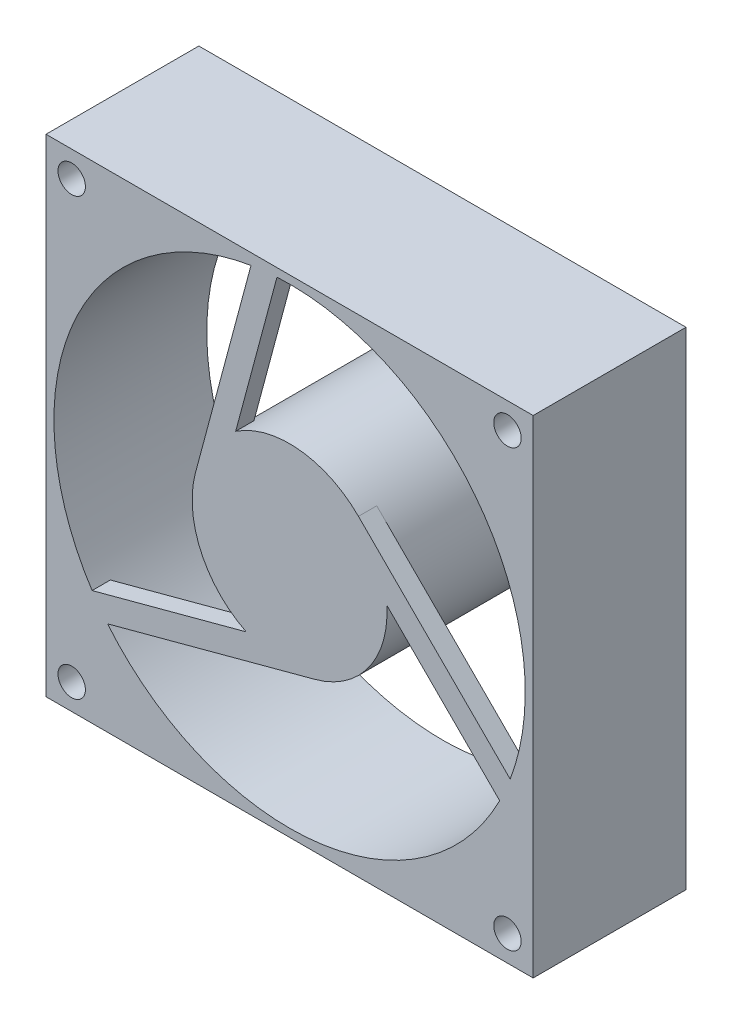
ISO-10303-21;
HEADER;
FILE_DESCRIPTION(('STEP AP214'),'2;1');
FILE_NAME('part.step','',(''),(''),'','','');
FILE_SCHEMA(('AUTOMOTIVE_DESIGN { 1 0 10303 214 1 1 1 1 }'));
ENDSEC;
DATA;
#1=APPLICATION_CONTEXT('core data for automotive mechanical design processes');
#2=APPLICATION_PROTOCOL_DEFINITION('international standard','automotive_design',2000,#1);
#3=PRODUCT_CONTEXT('',#1,'mechanical');
#4=PRODUCT('Part','Part','',(#3));
#5=PRODUCT_RELATED_PRODUCT_CATEGORY('part','',(#4));
#6=PRODUCT_DEFINITION_FORMATION('','',#4);
#7=PRODUCT_DEFINITION_CONTEXT('part definition',#1,'design');
#8=PRODUCT_DEFINITION('design','',#6,#7);
#9=PRODUCT_DEFINITION_SHAPE('','',#8);
#10=(LENGTH_UNIT() NAMED_UNIT(*) SI_UNIT(.MILLI.,.METRE.));
#11=(NAMED_UNIT(*) PLANE_ANGLE_UNIT() SI_UNIT($,.RADIAN.));
#12=(NAMED_UNIT(*) SI_UNIT($,.STERADIAN.) SOLID_ANGLE_UNIT());
#13=UNCERTAINTY_MEASURE_WITH_UNIT(LENGTH_MEASURE(1.E-05),#10,'distance_accuracy_value','');
#14=(GEOMETRIC_REPRESENTATION_CONTEXT(3) GLOBAL_UNCERTAINTY_ASSIGNED_CONTEXT((#13)) GLOBAL_UNIT_ASSIGNED_CONTEXT((#10,
#11,#12)) REPRESENTATION_CONTEXT('',''));
#15=CARTESIAN_POINT('',(0.,0.,0.));
#16=DIRECTION('',(0.,0.,1.));
#17=DIRECTION('',(1.,0.,0.));
#18=AXIS2_PLACEMENT_3D('',#15,#16,#17);
#19=CARTESIAN_POINT('',(0.,-40.,12.55));
#20=DIRECTION('',(0.,1.,0.));
#21=DIRECTION('',(-1.,0.,0.));
#22=AXIS2_PLACEMENT_3D('',#19,#20,#21);
#23=PLANE('',#22);
#24=DIRECTION('',(1.,0.,0.));
#25=VECTOR('',#24,1.);
#26=CARTESIAN_POINT('',(0.,-40.,-12.55));
#27=LINE('',#26,#25);
#28=CARTESIAN_POINT('',(-40.,-40.,-12.55));
#29=VERTEX_POINT('',#28);
#30=CARTESIAN_POINT('',(40.,-40.,-12.55));
#31=VERTEX_POINT('',#30);
#32=EDGE_CURVE('E357',#29,#31,#27,.T.);
#33=ORIENTED_EDGE('',*,*,#32,.T.);
#34=DIRECTION('',(0.,0.,-1.));
#35=VECTOR('',#34,1.);
#36=CARTESIAN_POINT('',(40.,-40.,12.55));
#37=LINE('',#36,#35);
#38=CARTESIAN_POINT('',(40.,-40.,12.55));
#39=VERTEX_POINT('',#38);
#40=EDGE_CURVE('E12',#39,#31,#37,.T.);
#41=ORIENTED_EDGE('',*,*,#40,.F.);
#42=DIRECTION('',(1.,0.,0.));
#43=VECTOR('',#42,1.);
#44=CARTESIAN_POINT('',(0.,-40.,12.55));
#45=LINE('',#44,#43);
#46=CARTESIAN_POINT('',(-40.,-40.,12.55));
#47=VERTEX_POINT('',#46);
#48=EDGE_CURVE('E322',#47,#39,#45,.T.);
#49=ORIENTED_EDGE('',*,*,#48,.F.);
#50=DIRECTION('',(0.,0.,-1.));
#51=VECTOR('',#50,1.);
#52=CARTESIAN_POINT('',(-40.,-40.,12.55));
#53=LINE('',#52,#51);
#54=EDGE_CURVE('E337',#47,#29,#53,.T.);
#55=ORIENTED_EDGE('',*,*,#54,.T.);
#56=EDGE_LOOP('',(#33,#41,#49,#55));
#57=FACE_BOUND('',#56,.T.);
#58=ADVANCED_FACE('F56',(#57),#23,.F.);
#59=CARTESIAN_POINT('',(40.,0.,12.55));
#60=DIRECTION('',(-1.,0.,0.));
#61=DIRECTION('',(0.,0.,1.));
#62=AXIS2_PLACEMENT_3D('',#59,#60,#61);
#63=PLANE('',#62);
#64=DIRECTION('',(0.,1.,0.));
#65=VECTOR('',#64,1.);
#66=CARTESIAN_POINT('',(40.,0.,-12.55));
#67=LINE('',#66,#65);
#68=CARTESIAN_POINT('',(40.,40.,-12.55));
#69=VERTEX_POINT('',#68);
#70=EDGE_CURVE('E361',#31,#69,#67,.T.);
#71=ORIENTED_EDGE('',*,*,#70,.T.);
#72=DIRECTION('',(0.,0.,-1.));
#73=VECTOR('',#72,1.);
#74=CARTESIAN_POINT('',(40.,40.,12.55));
#75=LINE('',#74,#73);
#76=CARTESIAN_POINT('',(40.,40.,12.55));
#77=VERTEX_POINT('',#76);
#78=EDGE_CURVE('E65',#77,#69,#75,.T.);
#79=ORIENTED_EDGE('',*,*,#78,.F.);
#80=DIRECTION('',(0.,1.,0.));
#81=VECTOR('',#80,1.);
#82=CARTESIAN_POINT('',(40.,0.,12.55));
#83=LINE('',#82,#81);
#84=EDGE_CURVE('E326',#39,#77,#83,.T.);
#85=ORIENTED_EDGE('',*,*,#84,.F.);
#86=ORIENTED_EDGE('',*,*,#40,.T.);
#87=EDGE_LOOP('',(#71,#79,#85,#86));
#88=FACE_BOUND('',#87,.T.);
#89=ADVANCED_FACE('F384',(#88),#63,.F.);
#90=CARTESIAN_POINT('',(0.,40.,12.55));
#91=DIRECTION('',(0.,1.,0.));
#92=DIRECTION('',(-1.,0.,0.));
#93=AXIS2_PLACEMENT_3D('',#90,#91,#92);
#94=PLANE('',#93);
#95=DIRECTION('',(1.,0.,0.));
#96=VECTOR('',#95,1.);
#97=CARTESIAN_POINT('',(0.,40.,-12.55));
#98=LINE('',#97,#96);
#99=CARTESIAN_POINT('',(-40.,40.,-12.55));
#100=VERTEX_POINT('',#99);
#101=EDGE_CURVE('E365',#100,#69,#98,.T.);
#102=ORIENTED_EDGE('',*,*,#101,.F.);
#103=DIRECTION('',(0.,0.,-1.));
#104=VECTOR('',#103,1.);
#105=CARTESIAN_POINT('',(-40.,40.,12.55));
#106=LINE('',#105,#104);
#107=CARTESIAN_POINT('',(-40.,40.,12.55));
#108=VERTEX_POINT('',#107);
#109=EDGE_CURVE('E375',#108,#100,#106,.T.);
#110=ORIENTED_EDGE('',*,*,#109,.F.);
#111=DIRECTION('',(1.,0.,0.));
#112=VECTOR('',#111,1.);
#113=CARTESIAN_POINT('',(0.,40.,12.55));
#114=LINE('',#113,#112);
#115=EDGE_CURVE('E329',#108,#77,#114,.T.);
#116=ORIENTED_EDGE('',*,*,#115,.T.);
#117=ORIENTED_EDGE('',*,*,#78,.T.);
#118=EDGE_LOOP('',(#102,#110,#116,#117));
#119=FACE_BOUND('',#118,.T.);
#120=ADVANCED_FACE('F381',(#119),#94,.T.);
#121=CARTESIAN_POINT('',(-35.7796031280393,35.7796031280393,12.55));
#122=DIRECTION('',(0.,0.,-1.));
#123=DIRECTION('',(-1.,0.,0.));
#124=AXIS2_PLACEMENT_3D('',#121,#122,#123);
#125=CYLINDRICAL_SURFACE('',#124,2.25);
#126=CARTESIAN_POINT('',(-35.7796031280393,35.7796031280393,12.55));
#127=DIRECTION('',(0.,0.,1.));
#128=DIRECTION('',(1.,0.,0.));
#129=AXIS2_PLACEMENT_3D('',#126,#127,#128);
#130=CIRCLE('',#129,2.25);
#131=CARTESIAN_POINT('',(-33.5296031280393,35.7796031280393,12.55));
#132=VERTEX_POINT('',#131);
#133=EDGE_CURVE('E318',#132,#132,#130,.T.);
#134=ORIENTED_EDGE('',*,*,#133,.T.);
#135=EDGE_LOOP('',(#134));
#136=FACE_BOUND('',#135,.T.);
#137=CARTESIAN_POINT('',(-35.7796031280393,35.7796031280393,-12.55));
#138=DIRECTION('',(0.,0.,1.));
#139=DIRECTION('',(1.,0.,0.));
#140=AXIS2_PLACEMENT_3D('',#137,#138,#139);
#141=CIRCLE('',#140,2.25);
#142=CARTESIAN_POINT('',(-33.5296031280393,35.7796031280393,-12.55));
#143=VERTEX_POINT('',#142);
#144=EDGE_CURVE('E353',#143,#143,#141,.T.);
#145=ORIENTED_EDGE('',*,*,#144,.F.);
#146=EDGE_LOOP('',(#145));
#147=FACE_BOUND('',#146,.T.);
#148=ADVANCED_FACE('F405',(#136,#147),#125,.F.);
#149=CARTESIAN_POINT('',(35.7796031280393,35.7796031280393,12.55));
#150=DIRECTION('',(0.,0.,-1.));
#151=DIRECTION('',(-1.,0.,0.));
#152=AXIS2_PLACEMENT_3D('',#149,#150,#151);
#153=CYLINDRICAL_SURFACE('',#152,2.25);
#154=CARTESIAN_POINT('',(35.7796031280393,35.7796031280393,12.55));
#155=DIRECTION('',(0.,0.,1.));
#156=DIRECTION('',(1.,0.,0.));
#157=AXIS2_PLACEMENT_3D('',#154,#155,#156);
#158=CIRCLE('',#157,2.25);
#159=CARTESIAN_POINT('',(38.0296031280393,35.7796031280393,12.55));
#160=VERTEX_POINT('',#159);
#161=EDGE_CURVE('E314',#160,#160,#158,.T.);
#162=ORIENTED_EDGE('',*,*,#161,.T.);
#163=EDGE_LOOP('',(#162));
#164=FACE_BOUND('',#163,.T.);
#165=CARTESIAN_POINT('',(35.7796031280393,35.7796031280393,-12.55));
#166=DIRECTION('',(0.,0.,1.));
#167=DIRECTION('',(1.,0.,0.));
#168=AXIS2_PLACEMENT_3D('',#165,#166,#167);
#169=CIRCLE('',#168,2.25);
#170=CARTESIAN_POINT('',(38.0296031280393,35.7796031280393,-12.55));
#171=VERTEX_POINT('',#170);
#172=EDGE_CURVE('E349',#171,#171,#169,.T.);
#173=ORIENTED_EDGE('',*,*,#172,.F.);
#174=EDGE_LOOP('',(#173));
#175=FACE_BOUND('',#174,.T.);
#176=ADVANCED_FACE('F408',(#164,#175),#153,.F.);
#177=CARTESIAN_POINT('',(35.7796031280393,-35.7796031280393,12.55));
#178=DIRECTION('',(0.,0.,-1.));
#179=DIRECTION('',(-1.,0.,0.));
#180=AXIS2_PLACEMENT_3D('',#177,#178,#179);
#181=CYLINDRICAL_SURFACE('',#180,2.25);
#182=CARTESIAN_POINT('',(35.7796031280393,-35.7796031280393,12.55));
#183=DIRECTION('',(0.,0.,1.));
#184=DIRECTION('',(1.,0.,0.));
#185=AXIS2_PLACEMENT_3D('',#182,#183,#184);
#186=CIRCLE('',#185,2.25);
#187=CARTESIAN_POINT('',(38.0296031280393,-35.7796031280393,12.55));
#188=VERTEX_POINT('',#187);
#189=EDGE_CURVE('E310',#188,#188,#186,.T.);
#190=ORIENTED_EDGE('',*,*,#189,.T.);
#191=EDGE_LOOP('',(#190));
#192=FACE_BOUND('',#191,.T.);
#193=CARTESIAN_POINT('',(35.7796031280393,-35.7796031280393,-12.55));
#194=DIRECTION('',(0.,0.,1.));
#195=DIRECTION('',(1.,0.,0.));
#196=AXIS2_PLACEMENT_3D('',#193,#194,#195);
#197=CIRCLE('',#196,2.25);
#198=CARTESIAN_POINT('',(38.0296031280393,-35.7796031280393,-12.55));
#199=VERTEX_POINT('',#198);
#200=EDGE_CURVE('E345',#199,#199,#197,.T.);
#201=ORIENTED_EDGE('',*,*,#200,.F.);
#202=EDGE_LOOP('',(#201));
#203=FACE_BOUND('',#202,.T.);
#204=ADVANCED_FACE('F412',(#192,#203),#181,.F.);
#205=CARTESIAN_POINT('',(-35.7796031280393,-35.7796031280393,12.55));
#206=DIRECTION('',(0.,0.,-1.));
#207=DIRECTION('',(-1.,0.,0.));
#208=AXIS2_PLACEMENT_3D('',#205,#206,#207);
#209=CYLINDRICAL_SURFACE('',#208,2.25);
#210=CARTESIAN_POINT('',(-35.7796031280393,-35.7796031280393,12.55));
#211=DIRECTION('',(0.,0.,1.));
#212=DIRECTION('',(1.,0.,0.));
#213=AXIS2_PLACEMENT_3D('',#210,#211,#212);
#214=CIRCLE('',#213,2.25);
#215=CARTESIAN_POINT('',(-33.5296031280393,-35.7796031280393,12.55));
#216=VERTEX_POINT('',#215);
#217=EDGE_CURVE('E304',#216,#216,#214,.T.);
#218=ORIENTED_EDGE('',*,*,#217,.T.);
#219=EDGE_LOOP('',(#218));
#220=FACE_BOUND('',#219,.T.);
#221=CARTESIAN_POINT('',(-35.7796031280393,-35.7796031280393,-12.55));
#222=DIRECTION('',(0.,0.,1.));
#223=DIRECTION('',(1.,0.,0.));
#224=AXIS2_PLACEMENT_3D('',#221,#222,#223);
#225=CIRCLE('',#224,2.25);
#226=CARTESIAN_POINT('',(-33.5296031280393,-35.7796031280393,-12.55));
#227=VERTEX_POINT('',#226);
#228=EDGE_CURVE('E341',#227,#227,#225,.T.);
#229=ORIENTED_EDGE('',*,*,#228,.F.);
#230=EDGE_LOOP('',(#229));
#231=FACE_BOUND('',#230,.T.);
#232=ADVANCED_FACE('F415',(#220,#231),#209,.F.);
#233=CARTESIAN_POINT('',(0.,0.,12.55));
#234=DIRECTION('',(0.,0.,-1.));
#235=DIRECTION('',(-1.,0.,0.));
#236=AXIS2_PLACEMENT_3D('',#233,#234,#235);
#237=CYLINDRICAL_SURFACE('',#236,38.7);
#238=DIRECTION('',(0.,0.,1.));
#239=VECTOR('',#238,1.);
#240=CARTESIAN_POINT('',(36.2304699257833,-13.6030529278135,9.55));
#241=LINE('',#240,#239);
#242=CARTESIAN_POINT('',(36.2304699257834,-13.6030529278137,9.55));
#243=VERTEX_POINT('',#242);
#244=CARTESIAN_POINT('',(36.2304699257833,-13.6030529278135,12.55));
#245=VERTEX_POINT('',#244);
#246=EDGE_CURVE('E210',#243,#245,#241,.T.);
#247=ORIENTED_EDGE('',*,*,#246,.T.);
#248=CARTESIAN_POINT('',(0.,0.,12.55));
#249=DIRECTION('',(0.,0.,1.));
#250=DIRECTION('',(1.,0.,0.));
#251=AXIS2_PLACEMENT_3D('',#248,#249,#250);
#252=CIRCLE('',#251,38.7);
#253=CARTESIAN_POINT('',(-2.06850336182368,38.6446800199216,12.55));
#254=VERTEX_POINT('',#253);
#255=EDGE_CURVE('E306',#245,#254,#252,.T.);
#256=ORIENTED_EDGE('',*,*,#255,.T.);
#257=DIRECTION('',(0.,0.,1.));
#258=VECTOR('',#257,1.);
#259=CARTESIAN_POINT('',(-2.06850336182374,38.6446800199213,9.55));
#260=LINE('',#259,#258);
#261=CARTESIAN_POINT('',(-2.06850336182375,38.6446800199216,9.55));
#262=VERTEX_POINT('',#261);
#263=EDGE_CURVE('E294',#262,#254,#260,.T.);
#264=ORIENTED_EDGE('',*,*,#263,.F.);
#265=CARTESIAN_POINT('',(0.,0.,9.55));
#266=DIRECTION('',(0.,0.,1.));
#267=DIRECTION('',(-1.,0.,0.));
#268=AXIS2_PLACEMENT_3D('',#265,#266,#267);
#269=CIRCLE('',#268,38.6999999999998);
#270=CARTESIAN_POINT('',(-6.3346455583804,38.1780338106835,9.55));
#271=VERTEX_POINT('',#270);
#272=EDGE_CURVE('E272',#262,#271,#269,.T.);
#273=ORIENTED_EDGE('',*,*,#272,.T.);
#274=DIRECTION('',(0.,0.,1.));
#275=VECTOR('',#274,1.);
#276=CARTESIAN_POINT('',(-6.33464555838046,38.1780338106832,9.55));
#277=LINE('',#276,#275);
#278=CARTESIAN_POINT('',(-6.33464555838046,38.1780338106832,12.55));
#279=VERTEX_POINT('',#278);
#280=EDGE_CURVE('E290',#271,#279,#277,.T.);
#281=ORIENTED_EDGE('',*,*,#280,.T.);
#282=CARTESIAN_POINT('',(-32.4330229374611,-21.1137164691138,12.55));
#283=VERTEX_POINT('',#282);
#284=EDGE_CURVE('E301',#279,#283,#252,.T.);
#285=ORIENTED_EDGE('',*,*,#284,.T.);
#286=DIRECTION('',(0.,0.,1.));
#287=VECTOR('',#286,1.);
#288=CARTESIAN_POINT('',(-32.4330229374608,-21.1137164691137,9.55));
#289=LINE('',#288,#287);
#290=CARTESIAN_POINT('',(-32.433022937461,-21.1137164691138,9.55));
#291=VERTEX_POINT('',#290);
#292=EDGE_CURVE('E246',#291,#283,#289,.T.);
#293=ORIENTED_EDGE('',*,*,#292,.F.);
#294=CARTESIAN_POINT('',(0.,0.,9.55));
#295=DIRECTION('',(0.,0.,1.));
#296=DIRECTION('',(0.500000000000004,-0.866025403784436,0.));
#297=AXIS2_PLACEMENT_3D('',#294,#295,#296);
#298=CIRCLE('',#297,38.6999999999998);
#299=CARTESIAN_POINT('',(-29.8958243674028,-24.5749808828696,9.55));
#300=VERTEX_POINT('',#299);
#301=EDGE_CURVE('E224',#291,#300,#298,.T.);
#302=ORIENTED_EDGE('',*,*,#301,.T.);
#303=DIRECTION('',(0.,0.,1.));
#304=VECTOR('',#303,1.);
#305=CARTESIAN_POINT('',(-29.8958243674026,-24.5749808828695,9.55));
#306=LINE('',#305,#304);
#307=CARTESIAN_POINT('',(-29.8958243674026,-24.5749808828695,12.55));
#308=VERTEX_POINT('',#307);
#309=EDGE_CURVE('E242',#300,#308,#306,.T.);
#310=ORIENTED_EDGE('',*,*,#309,.T.);
#311=CARTESIAN_POINT('',(34.501526299285,-17.5309635508076,12.55));
#312=VERTEX_POINT('',#311);
#313=EDGE_CURVE('E305',#308,#312,#252,.T.);
#314=ORIENTED_EDGE('',*,*,#313,.T.);
#315=DIRECTION('',(0.,0.,1.));
#316=VECTOR('',#315,1.);
#317=CARTESIAN_POINT('',(34.5015262992848,-17.5309635508075,9.55));
#318=LINE('',#317,#316);
#319=CARTESIAN_POINT('',(34.501526299285,-17.5309635508076,9.55));
#320=VERTEX_POINT('',#319);
#321=EDGE_CURVE('E72',#320,#312,#318,.T.);
#322=ORIENTED_EDGE('',*,*,#321,.F.);
#323=CARTESIAN_POINT('',(0.,0.,9.55));
#324=DIRECTION('',(0.,0.,1.));
#325=DIRECTION('',(0.499999999999992,0.866025403784443,0.));
#326=AXIS2_PLACEMENT_3D('',#323,#324,#325);
#327=CIRCLE('',#326,38.6999999999998);
#328=EDGE_CURVE('E76',#320,#243,#327,.T.);
#329=ORIENTED_EDGE('',*,*,#328,.T.);
#330=EDGE_LOOP('',(#247,#256,#264,#273,#281,#285,#293,#302,#310,#314,#322,#329));
#331=FACE_BOUND('',#330,.T.);
#332=CARTESIAN_POINT('',(0.,0.,-12.55));
#333=DIRECTION('',(0.,0.,1.));
#334=DIRECTION('',(1.,0.,0.));
#335=AXIS2_PLACEMENT_3D('',#332,#333,#334);
#336=CIRCLE('',#335,38.7);
#337=CARTESIAN_POINT('',(38.7,0.,-12.55));
#338=VERTEX_POINT('',#337);
#339=EDGE_CURVE('E289',#338,#338,#336,.T.);
#340=ORIENTED_EDGE('',*,*,#339,.F.);
#341=EDGE_LOOP('',(#340));
#342=FACE_BOUND('',#341,.T.);
#343=ADVANCED_FACE('F58',(#331,#342),#237,.F.);
#344=CARTESIAN_POINT('',(-40.,0.,12.55));
#345=DIRECTION('',(-1.,0.,0.));
#346=DIRECTION('',(0.,0.,1.));
#347=AXIS2_PLACEMENT_3D('',#344,#345,#346);
#348=PLANE('',#347);
#349=DIRECTION('',(0.,1.,0.));
#350=VECTOR('',#349,1.);
#351=CARTESIAN_POINT('',(-40.,0.,-12.55));
#352=LINE('',#351,#350);
#353=EDGE_CURVE('E369',#29,#100,#352,.T.);
#354=ORIENTED_EDGE('',*,*,#353,.F.);
#355=ORIENTED_EDGE('',*,*,#54,.F.);
#356=DIRECTION('',(0.,1.,0.));
#357=VECTOR('',#356,1.);
#358=CARTESIAN_POINT('',(-40.,0.,12.55));
#359=LINE('',#358,#357);
#360=EDGE_CURVE('E333',#47,#108,#359,.T.);
#361=ORIENTED_EDGE('',*,*,#360,.T.);
#362=ORIENTED_EDGE('',*,*,#109,.T.);
#363=EDGE_LOOP('',(#354,#355,#361,#362));
#364=FACE_BOUND('',#363,.T.);
#365=ADVANCED_FACE('F391',(#364),#348,.T.);
#366=CARTESIAN_POINT('',(0.,0.,12.55));
#367=DIRECTION('',(0.,0.,1.));
#368=DIRECTION('',(1.,0.,0.));
#369=AXIS2_PLACEMENT_3D('',#366,#367,#368);
#370=PLANE('',#369);
#371=ORIENTED_EDGE('',*,*,#255,.F.);
#372=DIRECTION('',(-0.707106781186553,0.707106781186541,0.));
#373=VECTOR('',#372,1.);
#374=CARTESIAN_POINT('',(11.3137084989844,11.3137084989849,12.55));
#375=LINE('',#374,#373);
#376=CARTESIAN_POINT('',(11.3137084989845,11.313708498985,12.55));
#377=VERTEX_POINT('',#376);
#378=EDGE_CURVE('E196',#245,#377,#375,.T.);
#379=ORIENTED_EDGE('',*,*,#378,.T.);
#380=CARTESIAN_POINT('',(0.,0.,12.55));
#381=DIRECTION('',(0.,0.,1.));
#382=DIRECTION('',(1.,0.,0.));
#383=AXIS2_PLACEMENT_3D('',#380,#381,#382);
#384=CIRCLE('',#383,16.);
#385=CARTESIAN_POINT('',(-8.85202660383478,13.3282266264118,12.55));
#386=VERTEX_POINT('',#385);
#387=EDGE_CURVE('E259',#377,#386,#384,.T.);
#388=ORIENTED_EDGE('',*,*,#387,.T.);
#389=DIRECTION('',(0.258819045102521,0.965925826289068,0.));
#390=VECTOR('',#389,1.);
#391=CARTESIAN_POINT('',(-8.85202660383478,13.3282266264118,12.55));
#392=LINE('',#391,#390);
#393=EDGE_CURVE('E257',#386,#254,#392,.T.);
#394=ORIENTED_EDGE('',*,*,#393,.T.);
#395=EDGE_LOOP('',(#371,#379,#388,#394));
#396=FACE_BOUND('',#395,.T.);
#397=ORIENTED_EDGE('',*,*,#313,.F.);
#398=DIRECTION('',(0.965925826289067,0.258819045102525,0.));
#399=VECTOR('',#398,1.);
#400=CARTESIAN_POINT('',(4.14110472164052,-15.4548132206249,12.55));
#401=LINE('',#400,#399);
#402=CARTESIAN_POINT('',(4.14110472164056,-15.454813220625,12.55));
#403=VERTEX_POINT('',#402);
#404=EDGE_CURVE('E220',#308,#403,#401,.T.);
#405=ORIENTED_EDGE('',*,*,#404,.T.);
#406=CARTESIAN_POINT('',(15.9685961477862,1.00196660069083,12.55));
#407=VERTEX_POINT('',#406);
#408=EDGE_CURVE('E258',#403,#407,#384,.T.);
#409=ORIENTED_EDGE('',*,*,#408,.T.);
#410=DIRECTION('',(0.707106781186553,-0.707106781186541,0.));
#411=VECTOR('',#410,1.);
#412=CARTESIAN_POINT('',(15.9685961477862,1.00196660069083,12.55));
#413=LINE('',#412,#411);
#414=EDGE_CURVE('E174',#407,#312,#413,.T.);
#415=ORIENTED_EDGE('',*,*,#414,.T.);
#416=EDGE_LOOP('',(#397,#405,#409,#415));
#417=FACE_BOUND('',#416,.T.);
#418=ORIENTED_EDGE('',*,*,#284,.F.);
#419=DIRECTION('',(-0.258819045102521,-0.965925826289068,0.));
#420=VECTOR('',#419,1.);
#421=CARTESIAN_POINT('',(-15.454813220625,4.14110472164014,12.55));
#422=LINE('',#421,#420);
#423=CARTESIAN_POINT('',(-15.454813220625,4.14110472164014,12.55));
#424=VERTEX_POINT('',#423);
#425=EDGE_CURVE('E268',#279,#424,#422,.T.);
#426=ORIENTED_EDGE('',*,*,#425,.T.);
#427=CARTESIAN_POINT('',(-7.11656954395137,-14.3301932271026,12.55));
#428=VERTEX_POINT('',#427);
#429=EDGE_CURVE('E253',#424,#428,#384,.T.);
#430=ORIENTED_EDGE('',*,*,#429,.T.);
#431=DIRECTION('',(-0.965925826289067,-0.258819045102525,0.));
#432=VECTOR('',#431,1.);
#433=CARTESIAN_POINT('',(-7.11656954395137,-14.3301932271026,12.55));
#434=LINE('',#433,#432);
#435=EDGE_CURVE('E209',#428,#283,#434,.T.);
#436=ORIENTED_EDGE('',*,*,#435,.T.);
#437=EDGE_LOOP('',(#418,#426,#430,#436));
#438=FACE_BOUND('',#437,.T.);
#439=ORIENTED_EDGE('',*,*,#217,.F.);
#440=EDGE_LOOP('',(#439));
#441=FACE_BOUND('',#440,.T.);
#442=ORIENTED_EDGE('',*,*,#189,.F.);
#443=EDGE_LOOP('',(#442));
#444=FACE_BOUND('',#443,.T.);
#445=ORIENTED_EDGE('',*,*,#161,.F.);
#446=EDGE_LOOP('',(#445));
#447=FACE_BOUND('',#446,.T.);
#448=ORIENTED_EDGE('',*,*,#133,.F.);
#449=EDGE_LOOP('',(#448));
#450=FACE_BOUND('',#449,.T.);
#451=ORIENTED_EDGE('',*,*,#48,.T.);
#452=ORIENTED_EDGE('',*,*,#84,.T.);
#453=ORIENTED_EDGE('',*,*,#115,.F.);
#454=ORIENTED_EDGE('',*,*,#360,.F.);
#455=EDGE_LOOP('',(#451,#452,#453,#454));
#456=FACE_BOUND('',#455,.T.);
#457=ADVANCED_FACE('F395',(#396,#417,#438,#441,#444,#447,#450,#456),#370,.T.);
#458=CARTESIAN_POINT('',(0.,0.,-12.55));
#459=DIRECTION('',(0.,0.,1.));
#460=DIRECTION('',(1.,0.,0.));
#461=AXIS2_PLACEMENT_3D('',#458,#459,#460);
#462=PLANE('',#461);
#463=ORIENTED_EDGE('',*,*,#339,.T.);
#464=EDGE_LOOP('',(#463));
#465=FACE_BOUND('',#464,.T.);
#466=ORIENTED_EDGE('',*,*,#228,.T.);
#467=EDGE_LOOP('',(#466));
#468=FACE_BOUND('',#467,.T.);
#469=ORIENTED_EDGE('',*,*,#200,.T.);
#470=EDGE_LOOP('',(#469));
#471=FACE_BOUND('',#470,.T.);
#472=ORIENTED_EDGE('',*,*,#172,.T.);
#473=EDGE_LOOP('',(#472));
#474=FACE_BOUND('',#473,.T.);
#475=ORIENTED_EDGE('',*,*,#144,.T.);
#476=EDGE_LOOP('',(#475));
#477=FACE_BOUND('',#476,.T.);
#478=ORIENTED_EDGE('',*,*,#32,.F.);
#479=ORIENTED_EDGE('',*,*,#353,.T.);
#480=ORIENTED_EDGE('',*,*,#101,.T.);
#481=ORIENTED_EDGE('',*,*,#70,.F.);
#482=EDGE_LOOP('',(#478,#479,#480,#481));
#483=FACE_BOUND('',#482,.T.);
#484=ADVANCED_FACE('F388',(#465,#468,#471,#474,#477,#483),#462,.F.);
#485=CARTESIAN_POINT('',(-15.454813220625,4.14110472164014,9.55));
#486=DIRECTION('',(-0.965925826289068,0.258819045102521,0.));
#487=DIRECTION('',(-0.258819045102521,-0.965925826289068,0.));
#488=AXIS2_PLACEMENT_3D('',#485,#486,#487);
#489=PLANE('',#488);
#490=ORIENTED_EDGE('',*,*,#425,.F.);
#491=ORIENTED_EDGE('',*,*,#280,.F.);
#492=DIRECTION('',(-0.258819045102521,-0.965925826289068,0.));
#493=VECTOR('',#492,1.);
#494=CARTESIAN_POINT('',(-15.454813220625,4.14110472164014,9.55));
#495=LINE('',#494,#493);
#496=CARTESIAN_POINT('',(-15.454813220625,4.14110472164014,9.55));
#497=VERTEX_POINT('',#496);
#498=EDGE_CURVE('E275',#271,#497,#495,.T.);
#499=ORIENTED_EDGE('',*,*,#498,.T.);
#500=DIRECTION('',(0.,0.,1.));
#501=VECTOR('',#500,1.);
#502=CARTESIAN_POINT('',(-15.454813220625,4.14110472164014,9.55));
#503=LINE('',#502,#501);
#504=EDGE_CURVE('E286',#497,#424,#503,.T.);
#505=ORIENTED_EDGE('',*,*,#504,.T.);
#506=EDGE_LOOP('',(#490,#491,#499,#505));
#507=FACE_BOUND('',#506,.T.);
#508=ADVANCED_FACE('F428',(#507),#489,.T.);
#509=CARTESIAN_POINT('',(-8.85202660383478,13.3282266264118,9.55));
#510=DIRECTION('',(0.965925826289068,-0.258819045102521,0.));
#511=DIRECTION('',(0.258819045102521,0.965925826289068,0.));
#512=AXIS2_PLACEMENT_3D('',#509,#510,#511);
#513=PLANE('',#512);
#514=ORIENTED_EDGE('',*,*,#393,.F.);
#515=DIRECTION('',(0.,0.,1.));
#516=VECTOR('',#515,1.);
#517=CARTESIAN_POINT('',(-8.85202660383478,13.3282266264118,9.55));
#518=LINE('',#517,#516);
#519=CARTESIAN_POINT('',(-8.85202660383491,13.328226626412,9.55));
#520=VERTEX_POINT('',#519);
#521=EDGE_CURVE('E279',#520,#386,#518,.T.);
#522=ORIENTED_EDGE('',*,*,#521,.F.);
#523=DIRECTION('',(0.258819045102521,0.965925826289068,0.));
#524=VECTOR('',#523,1.);
#525=CARTESIAN_POINT('',(-8.85202660383478,13.3282266264118,9.55));
#526=LINE('',#525,#524);
#527=EDGE_CURVE('E267',#520,#262,#526,.T.);
#528=ORIENTED_EDGE('',*,*,#527,.T.);
#529=ORIENTED_EDGE('',*,*,#263,.T.);
#530=EDGE_LOOP('',(#514,#522,#528,#529));
#531=FACE_BOUND('',#530,.T.);
#532=ADVANCED_FACE('F443',(#531),#513,.T.);
#533=CARTESIAN_POINT('',(0.,0.,9.55));
#534=DIRECTION('',(0.,0.,-1.));
#535=DIRECTION('',(-1.,0.,0.));
#536=AXIS2_PLACEMENT_3D('',#533,#534,#535);
#537=PLANE('',#536);
#538=CARTESIAN_POINT('',(0.,0.,9.55));
#539=DIRECTION('',(0.,0.,-1.));
#540=DIRECTION('',(-1.,0.,0.));
#541=AXIS2_PLACEMENT_3D('',#538,#539,#540);
#542=CIRCLE('',#541,15.9999999999998);
#543=EDGE_CURVE('E263',#497,#520,#542,.T.);
#544=ORIENTED_EDGE('',*,*,#543,.F.);
#545=ORIENTED_EDGE('',*,*,#498,.F.);
#546=ORIENTED_EDGE('',*,*,#272,.F.);
#547=ORIENTED_EDGE('',*,*,#527,.F.);
#548=EDGE_LOOP('',(#544,#545,#546,#547));
#549=FACE_BOUND('',#548,.T.);
#550=ADVANCED_FACE('F501',(#549),#537,.T.);
#551=CARTESIAN_POINT('',(0.,0.,12.55));
#552=DIRECTION('',(0.,0.,-1.));
#553=DIRECTION('',(-1.,0.,0.));
#554=AXIS2_PLACEMENT_3D('',#551,#552,#553);
#555=CYLINDRICAL_SURFACE('',#554,16.);
#556=ORIENTED_EDGE('',*,*,#387,.F.);
#557=DIRECTION('',(0.,0.,1.));
#558=VECTOR('',#557,1.);
#559=CARTESIAN_POINT('',(11.3137084989844,11.3137084989849,9.55));
#560=LINE('',#559,#558);
#561=CARTESIAN_POINT('',(11.3137084989844,11.3137084989849,9.55));
#562=VERTEX_POINT('',#561);
#563=EDGE_CURVE('E194',#562,#377,#560,.T.);
#564=ORIENTED_EDGE('',*,*,#563,.F.);
#565=CARTESIAN_POINT('',(0.,0.,9.55));
#566=DIRECTION('',(0.,0.,-1.));
#567=DIRECTION('',(0.499999999999992,0.866025403784443,0.));
#568=AXIS2_PLACEMENT_3D('',#565,#566,#567);
#569=CIRCLE('',#568,15.9999999999998);
#570=CARTESIAN_POINT('',(15.9685961477862,1.00196660069083,9.55));
#571=VERTEX_POINT('',#570);
#572=EDGE_CURVE('E185',#562,#571,#569,.T.);
#573=ORIENTED_EDGE('',*,*,#572,.T.);
#574=DIRECTION('',(0.,0.,1.));
#575=VECTOR('',#574,1.);
#576=CARTESIAN_POINT('',(15.9685961477862,1.00196660069083,9.55));
#577=LINE('',#576,#575);
#578=EDGE_CURVE('E169',#571,#407,#577,.T.);
#579=ORIENTED_EDGE('',*,*,#578,.T.);
#580=ORIENTED_EDGE('',*,*,#408,.F.);
#581=DIRECTION('',(0.,0.,1.));
#582=VECTOR('',#581,1.);
#583=CARTESIAN_POINT('',(4.14110472164052,-15.4548132206249,9.55));
#584=LINE('',#583,#582);
#585=CARTESIAN_POINT('',(4.14110472164052,-15.4548132206249,9.55));
#586=VERTEX_POINT('',#585);
#587=EDGE_CURVE('E237',#586,#403,#584,.T.);
#588=ORIENTED_EDGE('',*,*,#587,.F.);
#589=CARTESIAN_POINT('',(0.,0.,9.55));
#590=DIRECTION('',(0.,0.,-1.));
#591=DIRECTION('',(0.500000000000004,-0.866025403784436,0.));
#592=AXIS2_PLACEMENT_3D('',#589,#590,#591);
#593=CIRCLE('',#592,15.9999999999998);
#594=CARTESIAN_POINT('',(-7.11656954395137,-14.3301932271026,9.55));
#595=VERTEX_POINT('',#594);
#596=EDGE_CURVE('E215',#586,#595,#593,.T.);
#597=ORIENTED_EDGE('',*,*,#596,.T.);
#598=DIRECTION('',(0.,0.,1.));
#599=VECTOR('',#598,1.);
#600=CARTESIAN_POINT('',(-7.11656954395137,-14.3301932271026,9.55));
#601=LINE('',#600,#599);
#602=EDGE_CURVE('E231',#595,#428,#601,.T.);
#603=ORIENTED_EDGE('',*,*,#602,.T.);
#604=ORIENTED_EDGE('',*,*,#429,.F.);
#605=ORIENTED_EDGE('',*,*,#504,.F.);
#606=ORIENTED_EDGE('',*,*,#543,.T.);
#607=ORIENTED_EDGE('',*,*,#521,.T.);
#608=EDGE_LOOP('',(#556,#564,#573,#579,#580,#588,#597,#603,#604,#605,#606,#607));
#609=FACE_BOUND('',#608,.T.);
#610=CARTESIAN_POINT('',(0.,0.,-12.55));
#611=DIRECTION('',(0.,0.,1.));
#612=DIRECTION('',(1.,0.,0.));
#613=AXIS2_PLACEMENT_3D('',#610,#611,#612);
#614=CIRCLE('',#613,16.);
#615=CARTESIAN_POINT('',(16.,0.,-12.55));
#616=VERTEX_POINT('',#615);
#617=EDGE_CURVE('E241',#616,#616,#614,.T.);
#618=ORIENTED_EDGE('',*,*,#617,.T.);
#619=EDGE_LOOP('',(#618));
#620=FACE_BOUND('',#619,.T.);
#621=ADVANCED_FACE('F191',(#609,#620),#555,.T.);
#622=CARTESIAN_POINT('',(0.,0.,-12.55));
#623=DIRECTION('',(0.,0.,1.));
#624=DIRECTION('',(1.,0.,0.));
#625=AXIS2_PLACEMENT_3D('',#622,#623,#624);
#626=PLANE('',#625);
#627=ORIENTED_EDGE('',*,*,#617,.F.);
#628=EDGE_LOOP('',(#627));
#629=FACE_BOUND('',#628,.T.);
#630=ADVANCED_FACE('F517',(#629),#626,.F.);
#631=CARTESIAN_POINT('',(4.14110472164052,-15.4548132206249,9.55));
#632=DIRECTION('',(0.258819045102525,-0.965925826289067,0.));
#633=DIRECTION('',(0.965925826289067,0.258819045102525,0.));
#634=AXIS2_PLACEMENT_3D('',#631,#632,#633);
#635=PLANE('',#634);
#636=ORIENTED_EDGE('',*,*,#404,.F.);
#637=ORIENTED_EDGE('',*,*,#309,.F.);
#638=DIRECTION('',(0.965925826289067,0.258819045102525,0.));
#639=VECTOR('',#638,1.);
#640=CARTESIAN_POINT('',(4.14110472164052,-15.4548132206249,9.55));
#641=LINE('',#640,#639);
#642=EDGE_CURVE('E227',#300,#586,#641,.T.);
#643=ORIENTED_EDGE('',*,*,#642,.T.);
#644=ORIENTED_EDGE('',*,*,#587,.T.);
#645=EDGE_LOOP('',(#636,#637,#643,#644));
#646=FACE_BOUND('',#645,.T.);
#647=ADVANCED_FACE('F522',(#646),#635,.T.);
#648=CARTESIAN_POINT('',(-7.11656954395137,-14.3301932271026,9.55));
#649=DIRECTION('',(-0.258819045102525,0.965925826289067,0.));
#650=DIRECTION('',(-0.965925826289067,-0.258819045102525,0.));
#651=AXIS2_PLACEMENT_3D('',#648,#649,#650);
#652=PLANE('',#651);
#653=ORIENTED_EDGE('',*,*,#435,.F.);
#654=ORIENTED_EDGE('',*,*,#602,.F.);
#655=DIRECTION('',(-0.965925826289067,-0.258819045102525,0.));
#656=VECTOR('',#655,1.);
#657=CARTESIAN_POINT('',(-7.11656954395137,-14.3301932271026,9.55));
#658=LINE('',#657,#656);
#659=EDGE_CURVE('E219',#595,#291,#658,.T.);
#660=ORIENTED_EDGE('',*,*,#659,.T.);
#661=ORIENTED_EDGE('',*,*,#292,.T.);
#662=EDGE_LOOP('',(#653,#654,#660,#661));
#663=FACE_BOUND('',#662,.T.);
#664=ADVANCED_FACE('F550',(#663),#652,.T.);
#665=CARTESIAN_POINT('',(0.,0.,9.55));
#666=DIRECTION('',(0.,0.,-1.));
#667=DIRECTION('',(0.500000000000004,-0.866025403784436,0.));
#668=AXIS2_PLACEMENT_3D('',#665,#666,#667);
#669=PLANE('',#668);
#670=ORIENTED_EDGE('',*,*,#596,.F.);
#671=ORIENTED_EDGE('',*,*,#642,.F.);
#672=ORIENTED_EDGE('',*,*,#301,.F.);
#673=ORIENTED_EDGE('',*,*,#659,.F.);
#674=EDGE_LOOP('',(#670,#671,#672,#673));
#675=FACE_BOUND('',#674,.T.);
#676=ADVANCED_FACE('F560',(#675),#669,.T.);
#677=CARTESIAN_POINT('',(11.3137084989844,11.3137084989849,9.55));
#678=DIRECTION('',(0.707106781186542,0.707106781186553,0.));
#679=DIRECTION('',(-0.707106781186553,0.707106781186542,0.));
#680=AXIS2_PLACEMENT_3D('',#677,#678,#679);
#681=PLANE('',#680);
#682=ORIENTED_EDGE('',*,*,#378,.F.);
#683=ORIENTED_EDGE('',*,*,#246,.F.);
#684=DIRECTION('',(-0.707106781186553,0.707106781186541,0.));
#685=VECTOR('',#684,1.);
#686=CARTESIAN_POINT('',(11.3137084989844,11.3137084989849,9.55));
#687=LINE('',#686,#685);
#688=EDGE_CURVE('E180',#243,#562,#687,.T.);
#689=ORIENTED_EDGE('',*,*,#688,.T.);
#690=ORIENTED_EDGE('',*,*,#563,.T.);
#691=EDGE_LOOP('',(#682,#683,#689,#690));
#692=FACE_BOUND('',#691,.T.);
#693=ADVANCED_FACE('F570',(#692),#681,.T.);
#694=CARTESIAN_POINT('',(15.9685961477862,1.00196660069083,9.55));
#695=DIRECTION('',(-0.707106781186542,-0.707106781186553,0.));
#696=DIRECTION('',(0.707106781186553,-0.707106781186542,0.));
#697=AXIS2_PLACEMENT_3D('',#694,#695,#696);
#698=PLANE('',#697);
#699=ORIENTED_EDGE('',*,*,#414,.F.);
#700=ORIENTED_EDGE('',*,*,#578,.F.);
#701=DIRECTION('',(0.707106781186553,-0.707106781186541,0.));
#702=VECTOR('',#701,1.);
#703=CARTESIAN_POINT('',(15.9685961477862,1.00196660069083,9.55));
#704=LINE('',#703,#702);
#705=EDGE_CURVE('E172',#571,#320,#704,.T.);
#706=ORIENTED_EDGE('',*,*,#705,.T.);
#707=ORIENTED_EDGE('',*,*,#321,.T.);
#708=EDGE_LOOP('',(#699,#700,#706,#707));
#709=FACE_BOUND('',#708,.T.);
#710=ADVANCED_FACE('F171',(#709),#698,.T.);
#711=CARTESIAN_POINT('',(0.,0.,9.55));
#712=DIRECTION('',(0.,0.,-1.));
#713=DIRECTION('',(0.499999999999992,0.866025403784443,0.));
#714=AXIS2_PLACEMENT_3D('',#711,#712,#713);
#715=PLANE('',#714);
#716=ORIENTED_EDGE('',*,*,#572,.F.);
#717=ORIENTED_EDGE('',*,*,#688,.F.);
#718=ORIENTED_EDGE('',*,*,#328,.F.);
#719=ORIENTED_EDGE('',*,*,#705,.F.);
#720=EDGE_LOOP('',(#716,#717,#718,#719));
#721=FACE_BOUND('',#720,.T.);
#722=ADVANCED_FACE('F183',(#721),#715,.T.);
#723=CLOSED_SHELL('',(#58,#89,#120,#148,#176,#204,#232,#343,#365,#457,#484,#508,#532,#550,#621,
#630,#647,#664,#676,#693,#710,#722));
#724=MANIFOLD_SOLID_BREP('B2',#723);
#725=ADVANCED_BREP_SHAPE_REPRESENTATION('',(#18,#724),#14);
#726=SHAPE_DEFINITION_REPRESENTATION(#9,#725);
ENDSEC;
END-ISO-10303-21;
